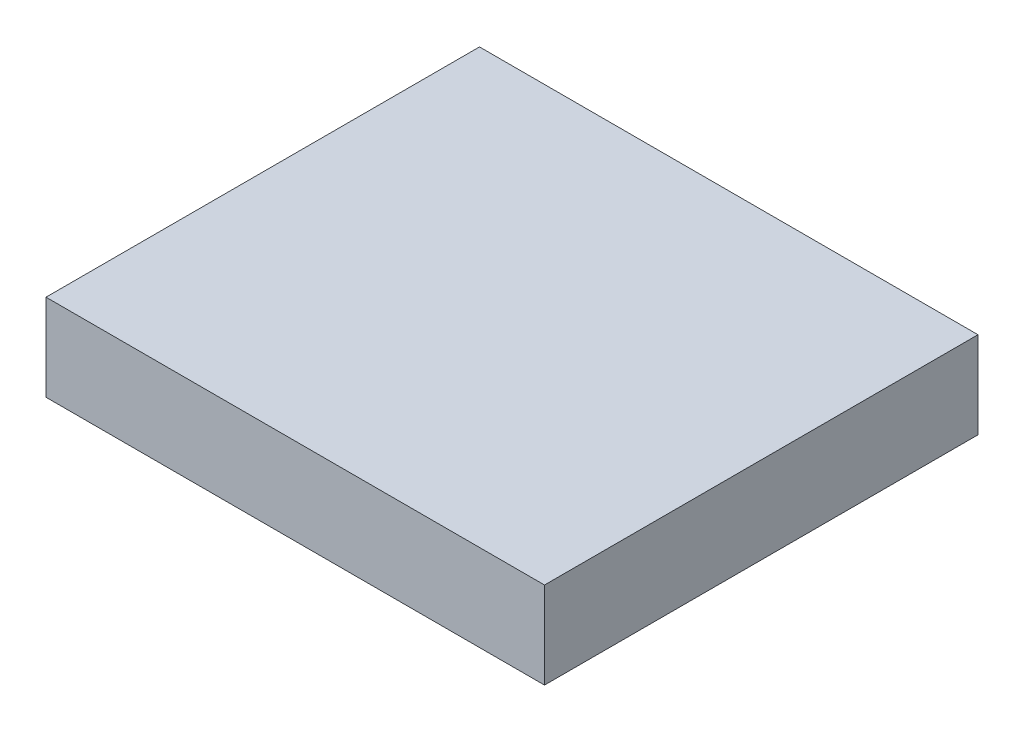
ISO-10303-21;
HEADER;
FILE_DESCRIPTION(('STEP AP214'),'2;1');
FILE_NAME('part.step','',(''),(''),'','','');
FILE_SCHEMA(('AUTOMOTIVE_DESIGN { 1 0 10303 214 1 1 1 1 }'));
ENDSEC;
DATA;
#1=APPLICATION_CONTEXT('core data for automotive mechanical design processes');
#2=APPLICATION_PROTOCOL_DEFINITION('international standard','automotive_design',2000,#1);
#3=PRODUCT_CONTEXT('',#1,'mechanical');
#4=PRODUCT('Part','Part','',(#3));
#5=PRODUCT_RELATED_PRODUCT_CATEGORY('part','',(#4));
#6=PRODUCT_DEFINITION_FORMATION('','',#4);
#7=PRODUCT_DEFINITION_CONTEXT('part definition',#1,'design');
#8=PRODUCT_DEFINITION('design','',#6,#7);
#9=PRODUCT_DEFINITION_SHAPE('','',#8);
#10=(LENGTH_UNIT() NAMED_UNIT(*) SI_UNIT(.MILLI.,.METRE.));
#11=(NAMED_UNIT(*) PLANE_ANGLE_UNIT() SI_UNIT($,.RADIAN.));
#12=(NAMED_UNIT(*) SI_UNIT($,.STERADIAN.) SOLID_ANGLE_UNIT());
#13=UNCERTAINTY_MEASURE_WITH_UNIT(LENGTH_MEASURE(1.E-05),#10,'distance_accuracy_value','');
#14=(GEOMETRIC_REPRESENTATION_CONTEXT(3) GLOBAL_UNCERTAINTY_ASSIGNED_CONTEXT((#13)) GLOBAL_UNIT_ASSIGNED_CONTEXT((#10,
#11,#12)) REPRESENTATION_CONTEXT('',''));
#15=CARTESIAN_POINT('',(0.,0.,0.));
#16=DIRECTION('',(0.,0.,1.));
#17=DIRECTION('',(1.,0.,0.));
#18=AXIS2_PLACEMENT_3D('',#15,#16,#17);
#19=CARTESIAN_POINT('',(-57.2732394366197,11.,-48.45));
#20=DIRECTION('',(1.,0.,0.));
#21=DIRECTION('',(0.,0.,-1.));
#22=AXIS2_PLACEMENT_3D('',#19,#20,#21);
#23=PLANE('',#22);
#24=DIRECTION('',(0.,0.,1.));
#25=VECTOR('',#24,1.);
#26=CARTESIAN_POINT('',(-57.2732394366197,-9.,-48.45));
#27=LINE('',#26,#25);
#28=CARTESIAN_POINT('',(-57.2732394366197,-9.,-48.45));
#29=VERTEX_POINT('',#28);
#30=CARTESIAN_POINT('',(-57.2732394366197,-9.,51.55));
#31=VERTEX_POINT('',#30);
#32=EDGE_CURVE('E101',#29,#31,#27,.T.);
#33=ORIENTED_EDGE('',*,*,#32,.T.);
#34=DIRECTION('',(0.,-1.,0.));
#35=VECTOR('',#34,1.);
#36=CARTESIAN_POINT('',(-57.2732394366197,11.,51.55));
#37=LINE('',#36,#35);
#38=CARTESIAN_POINT('',(-57.2732394366197,11.,51.55));
#39=VERTEX_POINT('',#38);
#40=EDGE_CURVE('E11',#39,#31,#37,.T.);
#41=ORIENTED_EDGE('',*,*,#40,.F.);
#42=DIRECTION('',(0.,0.,1.));
#43=VECTOR('',#42,1.);
#44=CARTESIAN_POINT('',(-57.2732394366197,11.,-48.45));
#45=LINE('',#44,#43);
#46=CARTESIAN_POINT('',(-57.2732394366197,11.,-48.45));
#47=VERTEX_POINT('',#46);
#48=EDGE_CURVE('E89',#47,#39,#45,.T.);
#49=ORIENTED_EDGE('',*,*,#48,.F.);
#50=DIRECTION('',(0.,-1.,0.));
#51=VECTOR('',#50,1.);
#52=CARTESIAN_POINT('',(-57.2732394366197,11.,-48.45));
#53=LINE('',#52,#51);
#54=EDGE_CURVE('E97',#47,#29,#53,.T.);
#55=ORIENTED_EDGE('',*,*,#54,.T.);
#56=EDGE_LOOP('',(#33,#41,#49,#55));
#57=FACE_BOUND('',#56,.T.);
#58=ADVANCED_FACE('F38',(#57),#23,.F.);
#59=CARTESIAN_POINT('',(-57.2732394366197,11.,51.55));
#60=DIRECTION('',(0.,0.,-1.));
#61=DIRECTION('',(-1.,0.,0.));
#62=AXIS2_PLACEMENT_3D('',#59,#60,#61);
#63=PLANE('',#62);
#64=DIRECTION('',(1.,0.,0.));
#65=VECTOR('',#64,1.);
#66=CARTESIAN_POINT('',(-57.2732394366197,-9.,51.55));
#67=LINE('',#66,#65);
#68=CARTESIAN_POINT('',(57.7267605633803,-9.,51.55));
#69=VERTEX_POINT('',#68);
#70=EDGE_CURVE('E93',#31,#69,#67,.T.);
#71=ORIENTED_EDGE('',*,*,#70,.T.);
#72=DIRECTION('',(0.,-1.,0.));
#73=VECTOR('',#72,1.);
#74=CARTESIAN_POINT('',(57.7267605633803,11.,51.55));
#75=LINE('',#74,#73);
#76=CARTESIAN_POINT('',(57.7267605633803,11.,51.55));
#77=VERTEX_POINT('',#76);
#78=EDGE_CURVE('E46',#77,#69,#75,.T.);
#79=ORIENTED_EDGE('',*,*,#78,.F.);
#80=DIRECTION('',(1.,0.,0.));
#81=VECTOR('',#80,1.);
#82=CARTESIAN_POINT('',(-57.2732394366197,11.,51.55));
#83=LINE('',#82,#81);
#84=EDGE_CURVE('E84',#39,#77,#83,.T.);
#85=ORIENTED_EDGE('',*,*,#84,.F.);
#86=ORIENTED_EDGE('',*,*,#40,.T.);
#87=EDGE_LOOP('',(#71,#79,#85,#86));
#88=FACE_BOUND('',#87,.T.);
#89=ADVANCED_FACE('F92',(#88),#63,.F.);
#90=CARTESIAN_POINT('',(57.7267605633803,11.,-48.45));
#91=DIRECTION('',(-1.,0.,0.));
#92=DIRECTION('',(0.,0.,1.));
#93=AXIS2_PLACEMENT_3D('',#90,#91,#92);
#94=PLANE('',#93);
#95=DIRECTION('',(0.,0.,-1.));
#96=VECTOR('',#95,1.);
#97=CARTESIAN_POINT('',(57.7267605633803,-9.,-48.45));
#98=LINE('',#97,#96);
#99=CARTESIAN_POINT('',(57.7267605633803,-9.,-48.45));
#100=VERTEX_POINT('',#99);
#101=EDGE_CURVE('E71',#69,#100,#98,.T.);
#102=ORIENTED_EDGE('',*,*,#101,.T.);
#103=DIRECTION('',(0.,-1.,0.));
#104=VECTOR('',#103,1.);
#105=CARTESIAN_POINT('',(57.7267605633803,11.,-48.45));
#106=LINE('',#105,#104);
#107=CARTESIAN_POINT('',(57.7267605633803,11.,-48.45));
#108=VERTEX_POINT('',#107);
#109=EDGE_CURVE('E94',#108,#100,#106,.T.);
#110=ORIENTED_EDGE('',*,*,#109,.F.);
#111=DIRECTION('',(0.,0.,-1.));
#112=VECTOR('',#111,1.);
#113=CARTESIAN_POINT('',(57.7267605633803,11.,-48.45));
#114=LINE('',#113,#112);
#115=EDGE_CURVE('E87',#77,#108,#114,.T.);
#116=ORIENTED_EDGE('',*,*,#115,.F.);
#117=ORIENTED_EDGE('',*,*,#78,.T.);
#118=EDGE_LOOP('',(#102,#110,#116,#117));
#119=FACE_BOUND('',#118,.T.);
#120=ADVANCED_FACE('F95',(#119),#94,.F.);
#121=CARTESIAN_POINT('',(-57.2732394366197,11.,-48.45));
#122=DIRECTION('',(0.,0.,1.));
#123=DIRECTION('',(1.,0.,0.));
#124=AXIS2_PLACEMENT_3D('',#121,#122,#123);
#125=PLANE('',#124);
#126=DIRECTION('',(-1.,0.,0.));
#127=VECTOR('',#126,1.);
#128=CARTESIAN_POINT('',(-57.2732394366197,-9.,-48.45));
#129=LINE('',#128,#127);
#130=EDGE_CURVE('E77',#100,#29,#129,.T.);
#131=ORIENTED_EDGE('',*,*,#130,.T.);
#132=ORIENTED_EDGE('',*,*,#54,.F.);
#133=DIRECTION('',(-1.,0.,0.));
#134=VECTOR('',#133,1.);
#135=CARTESIAN_POINT('',(-57.2732394366197,11.,-48.45));
#136=LINE('',#135,#134);
#137=EDGE_CURVE('E54',#108,#47,#136,.T.);
#138=ORIENTED_EDGE('',*,*,#137,.F.);
#139=ORIENTED_EDGE('',*,*,#109,.T.);
#140=EDGE_LOOP('',(#131,#132,#138,#139));
#141=FACE_BOUND('',#140,.T.);
#142=ADVANCED_FACE('F108',(#141),#125,.F.);
#143=CARTESIAN_POINT('',(-2.04084507042251,11.,-13.95));
#144=DIRECTION('',(0.,1.,0.));
#145=DIRECTION('',(0.,0.,1.));
#146=AXIS2_PLACEMENT_3D('',#143,#144,#145);
#147=PLANE('',#146);
#148=ORIENTED_EDGE('',*,*,#48,.T.);
#149=ORIENTED_EDGE('',*,*,#84,.T.);
#150=ORIENTED_EDGE('',*,*,#115,.T.);
#151=ORIENTED_EDGE('',*,*,#137,.T.);
#152=EDGE_LOOP('',(#148,#149,#150,#151));
#153=FACE_BOUND('',#152,.T.);
#154=ADVANCED_FACE('F85',(#153),#147,.T.);
#155=CARTESIAN_POINT('',(-2.04084507042251,-9.,-13.95));
#156=DIRECTION('',(0.,1.,0.));
#157=DIRECTION('',(0.,0.,1.));
#158=AXIS2_PLACEMENT_3D('',#155,#156,#157);
#159=PLANE('',#158);
#160=ORIENTED_EDGE('',*,*,#32,.F.);
#161=ORIENTED_EDGE('',*,*,#130,.F.);
#162=ORIENTED_EDGE('',*,*,#101,.F.);
#163=ORIENTED_EDGE('',*,*,#70,.F.);
#164=EDGE_LOOP('',(#160,#161,#162,#163));
#165=FACE_BOUND('',#164,.T.);
#166=ADVANCED_FACE('F111',(#165),#159,.F.);
#167=CLOSED_SHELL('',(#58,#89,#120,#142,#154,#166));
#168=MANIFOLD_SOLID_BREP('B2',#167);
#169=ADVANCED_BREP_SHAPE_REPRESENTATION('',(#18,#168),#14);
#170=SHAPE_DEFINITION_REPRESENTATION(#9,#169);
ENDSEC;
END-ISO-10303-21;
